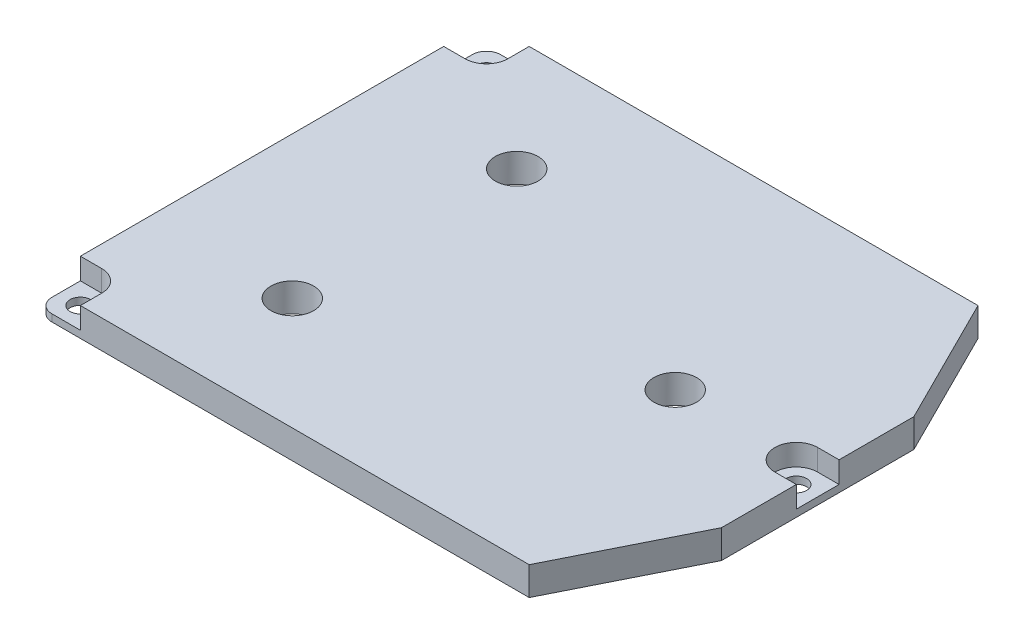
ISO-10303-21;
HEADER;
FILE_DESCRIPTION(('STEP AP214'),'2;1');
FILE_NAME('part.step','',(''),(''),'','','');
FILE_SCHEMA(('AUTOMOTIVE_DESIGN { 1 0 10303 214 1 1 1 1 }'));
ENDSEC;
DATA;
#1=APPLICATION_CONTEXT('core data for automotive mechanical design processes');
#2=APPLICATION_PROTOCOL_DEFINITION('international standard','automotive_design',2000,#1);
#3=PRODUCT_CONTEXT('',#1,'mechanical');
#4=PRODUCT('Part','Part','',(#3));
#5=PRODUCT_RELATED_PRODUCT_CATEGORY('part','',(#4));
#6=PRODUCT_DEFINITION_FORMATION('','',#4);
#7=PRODUCT_DEFINITION_CONTEXT('part definition',#1,'design');
#8=PRODUCT_DEFINITION('design','',#6,#7);
#9=PRODUCT_DEFINITION_SHAPE('','',#8);
#10=(LENGTH_UNIT() NAMED_UNIT(*) SI_UNIT(.MILLI.,.METRE.));
#11=(NAMED_UNIT(*) PLANE_ANGLE_UNIT() SI_UNIT($,.RADIAN.));
#12=(NAMED_UNIT(*) SI_UNIT($,.STERADIAN.) SOLID_ANGLE_UNIT());
#13=UNCERTAINTY_MEASURE_WITH_UNIT(LENGTH_MEASURE(1.E-05),#10,'distance_accuracy_value','');
#14=(GEOMETRIC_REPRESENTATION_CONTEXT(3) GLOBAL_UNCERTAINTY_ASSIGNED_CONTEXT((#13)) GLOBAL_UNIT_ASSIGNED_CONTEXT((#10,
#11,#12)) REPRESENTATION_CONTEXT('',''));
#15=CARTESIAN_POINT('',(0.,0.,0.));
#16=DIRECTION('',(0.,0.,1.));
#17=DIRECTION('',(1.,0.,0.));
#18=AXIS2_PLACEMENT_3D('',#15,#16,#17);
#19=CARTESIAN_POINT('',(75.,0.,-31.5));
#20=DIRECTION('',(0.,1.,0.));
#21=DIRECTION('',(0.,0.,1.));
#22=AXIS2_PLACEMENT_3D('',#19,#20,#21);
#23=CYLINDRICAL_SURFACE('',#22,1.45);
#24=CARTESIAN_POINT('',(75.,0.,-31.5));
#25=DIRECTION('',(0.,1.,0.));
#26=DIRECTION('',(0.,0.,1.));
#27=AXIS2_PLACEMENT_3D('',#24,#25,#26);
#28=CIRCLE('',#27,1.45);
#29=CARTESIAN_POINT('',(75.,0.,-30.05));
#30=VERTEX_POINT('',#29);
#31=EDGE_CURVE('E287',#30,#30,#28,.T.);
#32=ORIENTED_EDGE('',*,*,#31,.F.);
#33=EDGE_LOOP('',(#32));
#34=FACE_BOUND('',#33,.T.);
#35=CARTESIAN_POINT('',(75.,1.,-31.5));
#36=DIRECTION('',(0.,1.,0.));
#37=DIRECTION('',(0.,0.,1.));
#38=AXIS2_PLACEMENT_3D('',#35,#36,#37);
#39=CIRCLE('',#38,1.45);
#40=CARTESIAN_POINT('',(75.,1.,-30.05));
#41=VERTEX_POINT('',#40);
#42=EDGE_CURVE('E279',#41,#41,#39,.F.);
#43=ORIENTED_EDGE('',*,*,#42,.F.);
#44=EDGE_LOOP('',(#43));
#45=FACE_BOUND('',#44,.T.);
#46=ADVANCED_FACE('F36',(#34,#45),#23,.F.);
#47=CARTESIAN_POINT('',(3.,0.,-60.));
#48=DIRECTION('',(0.,1.,0.));
#49=DIRECTION('',(0.,0.,1.));
#50=AXIS2_PLACEMENT_3D('',#47,#48,#49);
#51=CYLINDRICAL_SURFACE('',#50,1.45);
#52=CARTESIAN_POINT('',(3.,0.,-60.));
#53=DIRECTION('',(0.,1.,0.));
#54=DIRECTION('',(0.,0.,1.));
#55=AXIS2_PLACEMENT_3D('',#52,#53,#54);
#56=CIRCLE('',#55,1.45);
#57=CARTESIAN_POINT('',(3.,0.,-58.55));
#58=VERTEX_POINT('',#57);
#59=EDGE_CURVE('E284',#58,#58,#56,.T.);
#60=ORIENTED_EDGE('',*,*,#59,.F.);
#61=EDGE_LOOP('',(#60));
#62=FACE_BOUND('',#61,.T.);
#63=CARTESIAN_POINT('',(3.,1.,-60.));
#64=DIRECTION('',(0.,1.,0.));
#65=DIRECTION('',(0.,0.,1.));
#66=AXIS2_PLACEMENT_3D('',#63,#64,#65);
#67=CIRCLE('',#66,1.45);
#68=CARTESIAN_POINT('',(3.,1.,-58.55));
#69=VERTEX_POINT('',#68);
#70=EDGE_CURVE('E276',#69,#69,#67,.F.);
#71=ORIENTED_EDGE('',*,*,#70,.F.);
#72=EDGE_LOOP('',(#71));
#73=FACE_BOUND('',#72,.T.);
#74=ADVANCED_FACE('F461',(#62,#73),#51,.F.);
#75=CARTESIAN_POINT('',(3.,0.,-3.));
#76=DIRECTION('',(0.,1.,0.));
#77=DIRECTION('',(0.,0.,1.));
#78=AXIS2_PLACEMENT_3D('',#75,#76,#77);
#79=CYLINDRICAL_SURFACE('',#78,1.45);
#80=CARTESIAN_POINT('',(3.,0.,-3.));
#81=DIRECTION('',(0.,1.,0.));
#82=DIRECTION('',(0.,0.,1.));
#83=AXIS2_PLACEMENT_3D('',#80,#81,#82);
#84=CIRCLE('',#83,1.45);
#85=CARTESIAN_POINT('',(3.,0.,-1.55));
#86=VERTEX_POINT('',#85);
#87=EDGE_CURVE('E280',#86,#86,#84,.T.);
#88=ORIENTED_EDGE('',*,*,#87,.F.);
#89=EDGE_LOOP('',(#88));
#90=FACE_BOUND('',#89,.T.);
#91=CARTESIAN_POINT('',(3.,1.,-3.));
#92=DIRECTION('',(0.,1.,0.));
#93=DIRECTION('',(0.,0.,1.));
#94=AXIS2_PLACEMENT_3D('',#91,#92,#93);
#95=CIRCLE('',#94,1.45);
#96=CARTESIAN_POINT('',(3.,1.,-1.55));
#97=VERTEX_POINT('',#96);
#98=EDGE_CURVE('E217',#97,#97,#95,.F.);
#99=ORIENTED_EDGE('',*,*,#98,.F.);
#100=EDGE_LOOP('',(#99));
#101=FACE_BOUND('',#100,.T.);
#102=ADVANCED_FACE('F467',(#90,#101),#79,.F.);
#103=CARTESIAN_POINT('',(2.,4.,-61.));
#104=DIRECTION('',(0.,-1.,0.));
#105=DIRECTION('',(0.,0.,-1.));
#106=AXIS2_PLACEMENT_3D('',#103,#104,#105);
#107=CYLINDRICAL_SURFACE('',#106,2.);
#108=DIRECTION('',(0.,-1.,0.));
#109=VECTOR('',#108,1.);
#110=CARTESIAN_POINT('',(0.,4.,-61.));
#111=LINE('',#110,#109);
#112=CARTESIAN_POINT('',(0.,1.,-61.));
#113=VERTEX_POINT('',#112);
#114=CARTESIAN_POINT('',(0.,0.,-61.));
#115=VERTEX_POINT('',#114);
#116=EDGE_CURVE('E335',#113,#115,#111,.T.);
#117=ORIENTED_EDGE('',*,*,#116,.F.);
#118=CARTESIAN_POINT('',(2.,1.,-61.));
#119=DIRECTION('',(0.,1.,0.));
#120=DIRECTION('',(0.,0.,1.));
#121=AXIS2_PLACEMENT_3D('',#118,#119,#120);
#122=CIRCLE('',#121,2.);
#123=CARTESIAN_POINT('',(2.,1.,-63.));
#124=VERTEX_POINT('',#123);
#125=EDGE_CURVE('E11',#113,#124,#122,.F.);
#126=ORIENTED_EDGE('',*,*,#125,.T.);
#127=DIRECTION('',(0.,-1.,0.));
#128=VECTOR('',#127,1.);
#129=CARTESIAN_POINT('',(2.,4.,-63.));
#130=LINE('',#129,#128);
#131=CARTESIAN_POINT('',(2.,0.,-63.));
#132=VERTEX_POINT('',#131);
#133=EDGE_CURVE('E341',#132,#124,#130,.F.);
#134=ORIENTED_EDGE('',*,*,#133,.F.);
#135=CARTESIAN_POINT('',(2.,0.,-61.));
#136=DIRECTION('',(0.,-1.,0.));
#137=DIRECTION('',(0.,0.,-1.));
#138=AXIS2_PLACEMENT_3D('',#135,#136,#137);
#139=CIRCLE('',#138,2.);
#140=EDGE_CURVE('E339',#115,#132,#139,.T.);
#141=ORIENTED_EDGE('',*,*,#140,.F.);
#142=EDGE_LOOP('',(#117,#126,#134,#141));
#143=FACE_BOUND('',#142,.T.);
#144=ADVANCED_FACE('F414',(#143),#107,.T.);
#145=CARTESIAN_POINT('',(2.,4.,-2.));
#146=DIRECTION('',(0.,-1.,0.));
#147=DIRECTION('',(0.,0.,-1.));
#148=AXIS2_PLACEMENT_3D('',#145,#146,#147);
#149=CYLINDRICAL_SURFACE('',#148,2.);
#150=DIRECTION('',(0.,-1.,0.));
#151=VECTOR('',#150,1.);
#152=CARTESIAN_POINT('',(2.,4.,0.));
#153=LINE('',#152,#151);
#154=CARTESIAN_POINT('',(2.,1.,0.));
#155=VERTEX_POINT('',#154);
#156=CARTESIAN_POINT('',(2.,0.,0.));
#157=VERTEX_POINT('',#156);
#158=EDGE_CURVE('E344',#155,#157,#153,.T.);
#159=ORIENTED_EDGE('',*,*,#158,.F.);
#160=CARTESIAN_POINT('',(2.,1.,-2.));
#161=DIRECTION('',(0.,1.,0.));
#162=DIRECTION('',(0.,0.,1.));
#163=AXIS2_PLACEMENT_3D('',#160,#161,#162);
#164=CIRCLE('',#163,2.);
#165=CARTESIAN_POINT('',(0.,1.,-2.));
#166=VERTEX_POINT('',#165);
#167=EDGE_CURVE('E45',#155,#166,#164,.F.);
#168=ORIENTED_EDGE('',*,*,#167,.T.);
#169=DIRECTION('',(0.,-1.,0.));
#170=VECTOR('',#169,1.);
#171=CARTESIAN_POINT('',(0.,4.,-2.));
#172=LINE('',#171,#170);
#173=CARTESIAN_POINT('',(0.,0.,-2.));
#174=VERTEX_POINT('',#173);
#175=EDGE_CURVE('E332',#174,#166,#172,.F.);
#176=ORIENTED_EDGE('',*,*,#175,.F.);
#177=CARTESIAN_POINT('',(2.,0.,-2.));
#178=DIRECTION('',(0.,-1.,0.));
#179=DIRECTION('',(0.,0.,-1.));
#180=AXIS2_PLACEMENT_3D('',#177,#178,#179);
#181=CIRCLE('',#180,2.);
#182=EDGE_CURVE('E337',#157,#174,#181,.T.);
#183=ORIENTED_EDGE('',*,*,#182,.F.);
#184=EDGE_LOOP('',(#159,#168,#176,#183));
#185=FACE_BOUND('',#184,.T.);
#186=ADVANCED_FACE('F38',(#185),#149,.T.);
#187=CARTESIAN_POINT('',(0.,4.,0.));
#188=DIRECTION('',(1.,0.,0.));
#189=DIRECTION('',(0.,0.,-1.));
#190=AXIS2_PLACEMENT_3D('',#187,#188,#189);
#191=PLANE('',#190);
#192=DIRECTION('',(0.,0.,1.));
#193=VECTOR('',#192,1.);
#194=CARTESIAN_POINT('',(0.,1.,-3.));
#195=LINE('',#194,#193);
#196=CARTESIAN_POINT('',(0.,1.,-6.));
#197=VERTEX_POINT('',#196);
#198=EDGE_CURVE('E194',#197,#166,#195,.T.);
#199=ORIENTED_EDGE('',*,*,#198,.F.);
#200=DIRECTION('',(0.,1.,0.));
#201=VECTOR('',#200,1.);
#202=CARTESIAN_POINT('',(0.,1.,-6.));
#203=LINE('',#202,#201);
#204=CARTESIAN_POINT('',(0.,4.,-6.));
#205=VERTEX_POINT('',#204);
#206=EDGE_CURVE('E185',#197,#205,#203,.T.);
#207=ORIENTED_EDGE('',*,*,#206,.T.);
#208=DIRECTION('',(0.,0.,1.));
#209=VECTOR('',#208,1.);
#210=CARTESIAN_POINT('',(0.,4.,0.));
#211=LINE('',#210,#209);
#212=CARTESIAN_POINT('',(0.,4.,-57.));
#213=VERTEX_POINT('',#212);
#214=EDGE_CURVE('E290',#213,#205,#211,.T.);
#215=ORIENTED_EDGE('',*,*,#214,.F.);
#216=DIRECTION('',(0.,1.,0.));
#217=VECTOR('',#216,1.);
#218=CARTESIAN_POINT('',(0.,1.,-57.));
#219=LINE('',#218,#217);
#220=CARTESIAN_POINT('',(0.,1.,-57.));
#221=VERTEX_POINT('',#220);
#222=EDGE_CURVE('E268',#221,#213,#219,.T.);
#223=ORIENTED_EDGE('',*,*,#222,.F.);
#224=DIRECTION('',(0.,0.,1.));
#225=VECTOR('',#224,1.);
#226=CARTESIAN_POINT('',(0.,1.,-57.));
#227=LINE('',#226,#225);
#228=EDGE_CURVE('E254',#113,#221,#227,.T.);
#229=ORIENTED_EDGE('',*,*,#228,.F.);
#230=ORIENTED_EDGE('',*,*,#116,.T.);
#231=DIRECTION('',(0.,0.,1.));
#232=VECTOR('',#231,1.);
#233=CARTESIAN_POINT('',(0.,0.,0.));
#234=LINE('',#233,#232);
#235=EDGE_CURVE('E283',#115,#174,#234,.T.);
#236=ORIENTED_EDGE('',*,*,#235,.T.);
#237=ORIENTED_EDGE('',*,*,#175,.T.);
#238=EDGE_LOOP('',(#199,#207,#215,#223,#229,#230,#236,#237));
#239=FACE_BOUND('',#238,.T.);
#240=ADVANCED_FACE('F383',(#239),#191,.F.);
#241=CARTESIAN_POINT('',(63.,4.,0.));
#242=DIRECTION('',(0.,0.,-1.));
#243=DIRECTION('',(-1.,0.,0.));
#244=AXIS2_PLACEMENT_3D('',#241,#242,#243);
#245=PLANE('',#244);
#246=DIRECTION('',(1.,0.,0.));
#247=VECTOR('',#246,1.);
#248=CARTESIAN_POINT('',(0.,4.,0.));
#249=LINE('',#248,#247);
#250=CARTESIAN_POINT('',(6.,4.,0.));
#251=VERTEX_POINT('',#250);
#252=CARTESIAN_POINT('',(69.,4.,0.));
#253=VERTEX_POINT('',#252);
#254=EDGE_CURVE('E293',#251,#253,#249,.T.);
#255=ORIENTED_EDGE('',*,*,#254,.F.);
#256=DIRECTION('',(0.,1.,0.));
#257=VECTOR('',#256,1.);
#258=CARTESIAN_POINT('',(6.,1.,0.));
#259=LINE('',#258,#257);
#260=CARTESIAN_POINT('',(6.,1.,0.));
#261=VERTEX_POINT('',#260);
#262=EDGE_CURVE('E218',#261,#251,#259,.T.);
#263=ORIENTED_EDGE('',*,*,#262,.F.);
#264=DIRECTION('',(1.,0.,0.));
#265=VECTOR('',#264,1.);
#266=CARTESIAN_POINT('',(6.,1.,0.));
#267=LINE('',#266,#265);
#268=EDGE_CURVE('E209',#155,#261,#267,.T.);
#269=ORIENTED_EDGE('',*,*,#268,.F.);
#270=ORIENTED_EDGE('',*,*,#158,.T.);
#271=DIRECTION('',(1.,0.,0.));
#272=VECTOR('',#271,1.);
#273=CARTESIAN_POINT('',(63.,0.,0.));
#274=LINE('',#273,#272);
#275=CARTESIAN_POINT('',(69.,0.,0.));
#276=VERTEX_POINT('',#275);
#277=EDGE_CURVE('E310',#157,#276,#274,.T.);
#278=ORIENTED_EDGE('',*,*,#277,.T.);
#279=DIRECTION('',(0.,-1.,0.));
#280=VECTOR('',#279,1.);
#281=CARTESIAN_POINT('',(69.,4.,0.));
#282=LINE('',#281,#280);
#283=EDGE_CURVE('E329',#253,#276,#282,.T.);
#284=ORIENTED_EDGE('',*,*,#283,.F.);
#285=EDGE_LOOP('',(#255,#263,#269,#270,#278,#284));
#286=FACE_BOUND('',#285,.T.);
#287=ADVANCED_FACE('F392',(#286),#245,.F.);
#288=CARTESIAN_POINT('',(69.,4.,0.));
#289=DIRECTION('',(-0.894427190999916,0.,-0.447213595499957));
#290=DIRECTION('',(-0.447213595499957,0.,0.894427190999916));
#291=AXIS2_PLACEMENT_3D('',#288,#289,#290);
#292=PLANE('',#291);
#293=DIRECTION('',(0.447213595499957,0.,-0.894427190999916));
#294=VECTOR('',#293,1.);
#295=CARTESIAN_POINT('',(69.,0.,0.));
#296=LINE('',#295,#294);
#297=CARTESIAN_POINT('',(78.,0.,-18.));
#298=VERTEX_POINT('',#297);
#299=EDGE_CURVE('E312',#276,#298,#296,.T.);
#300=ORIENTED_EDGE('',*,*,#299,.T.);
#301=DIRECTION('',(0.,-1.,0.));
#302=VECTOR('',#301,1.);
#303=CARTESIAN_POINT('',(78.,4.,-18.));
#304=LINE('',#303,#302);
#305=CARTESIAN_POINT('',(78.,4.,-18.));
#306=VERTEX_POINT('',#305);
#307=EDGE_CURVE('E326',#306,#298,#304,.T.);
#308=ORIENTED_EDGE('',*,*,#307,.F.);
#309=DIRECTION('',(0.447213595499957,0.,-0.894427190999916));
#310=VECTOR('',#309,1.);
#311=CARTESIAN_POINT('',(69.,4.,0.));
#312=LINE('',#311,#310);
#313=EDGE_CURVE('E296',#253,#306,#312,.T.);
#314=ORIENTED_EDGE('',*,*,#313,.F.);
#315=ORIENTED_EDGE('',*,*,#283,.T.);
#316=EDGE_LOOP('',(#300,#308,#314,#315));
#317=FACE_BOUND('',#316,.T.);
#318=ADVANCED_FACE('F433',(#317),#292,.F.);
#319=CARTESIAN_POINT('',(78.,4.,-18.));
#320=DIRECTION('',(-1.,0.,0.));
#321=DIRECTION('',(0.,0.,1.));
#322=AXIS2_PLACEMENT_3D('',#319,#320,#321);
#323=PLANE('',#322);
#324=DIRECTION('',(0.,0.,-1.));
#325=VECTOR('',#324,1.);
#326=CARTESIAN_POINT('',(78.,4.,-18.));
#327=LINE('',#326,#325);
#328=CARTESIAN_POINT('',(78.,4.,-34.5));
#329=VERTEX_POINT('',#328);
#330=CARTESIAN_POINT('',(78.,4.,-45.));
#331=VERTEX_POINT('',#330);
#332=EDGE_CURVE('E298',#329,#331,#327,.T.);
#333=ORIENTED_EDGE('',*,*,#332,.F.);
#334=DIRECTION('',(0.,1.,0.));
#335=VECTOR('',#334,1.);
#336=CARTESIAN_POINT('',(78.,1.,-34.5));
#337=LINE('',#336,#335);
#338=CARTESIAN_POINT('',(78.,1.,-34.5));
#339=VERTEX_POINT('',#338);
#340=EDGE_CURVE('E241',#339,#329,#337,.T.);
#341=ORIENTED_EDGE('',*,*,#340,.F.);
#342=DIRECTION('',(0.,0.,-1.));
#343=VECTOR('',#342,1.);
#344=CARTESIAN_POINT('',(78.,1.,-28.5));
#345=LINE('',#344,#343);
#346=CARTESIAN_POINT('',(78.,1.,-28.5));
#347=VERTEX_POINT('',#346);
#348=EDGE_CURVE('E228',#347,#339,#345,.T.);
#349=ORIENTED_EDGE('',*,*,#348,.F.);
#350=DIRECTION('',(0.,1.,0.));
#351=VECTOR('',#350,1.);
#352=CARTESIAN_POINT('',(78.,1.,-28.5));
#353=LINE('',#352,#351);
#354=CARTESIAN_POINT('',(78.,4.,-28.5));
#355=VERTEX_POINT('',#354);
#356=EDGE_CURVE('E243',#347,#355,#353,.T.);
#357=ORIENTED_EDGE('',*,*,#356,.T.);
#358=EDGE_CURVE('E299',#306,#355,#327,.T.);
#359=ORIENTED_EDGE('',*,*,#358,.F.);
#360=ORIENTED_EDGE('',*,*,#307,.T.);
#361=DIRECTION('',(0.,0.,-1.));
#362=VECTOR('',#361,1.);
#363=CARTESIAN_POINT('',(78.,0.,-18.));
#364=LINE('',#363,#362);
#365=CARTESIAN_POINT('',(78.,0.,-45.));
#366=VERTEX_POINT('',#365);
#367=EDGE_CURVE('E314',#298,#366,#364,.T.);
#368=ORIENTED_EDGE('',*,*,#367,.T.);
#369=DIRECTION('',(0.,-1.,0.));
#370=VECTOR('',#369,1.);
#371=CARTESIAN_POINT('',(78.,4.,-45.));
#372=LINE('',#371,#370);
#373=EDGE_CURVE('E323',#331,#366,#372,.T.);
#374=ORIENTED_EDGE('',*,*,#373,.F.);
#375=EDGE_LOOP('',(#333,#341,#349,#357,#359,#360,#368,#374));
#376=FACE_BOUND('',#375,.T.);
#377=ADVANCED_FACE('F427',(#376),#323,.F.);
#378=CARTESIAN_POINT('',(78.,4.,-45.));
#379=DIRECTION('',(-0.894427190999916,0.,0.447213595499958));
#380=DIRECTION('',(0.447213595499958,0.,0.894427190999916));
#381=AXIS2_PLACEMENT_3D('',#378,#379,#380);
#382=PLANE('',#381);
#383=DIRECTION('',(-0.447213595499958,0.,-0.894427190999916));
#384=VECTOR('',#383,1.);
#385=CARTESIAN_POINT('',(78.,0.,-45.));
#386=LINE('',#385,#384);
#387=CARTESIAN_POINT('',(69.,0.,-63.));
#388=VERTEX_POINT('',#387);
#389=EDGE_CURVE('E316',#366,#388,#386,.T.);
#390=ORIENTED_EDGE('',*,*,#389,.T.);
#391=DIRECTION('',(0.,-1.,0.));
#392=VECTOR('',#391,1.);
#393=CARTESIAN_POINT('',(69.,4.,-63.));
#394=LINE('',#393,#392);
#395=CARTESIAN_POINT('',(69.,4.,-63.));
#396=VERTEX_POINT('',#395);
#397=EDGE_CURVE('E307',#396,#388,#394,.T.);
#398=ORIENTED_EDGE('',*,*,#397,.F.);
#399=DIRECTION('',(-0.447213595499958,0.,-0.894427190999916));
#400=VECTOR('',#399,1.);
#401=CARTESIAN_POINT('',(78.,4.,-45.));
#402=LINE('',#401,#400);
#403=EDGE_CURVE('E302',#331,#396,#402,.T.);
#404=ORIENTED_EDGE('',*,*,#403,.F.);
#405=ORIENTED_EDGE('',*,*,#373,.T.);
#406=EDGE_LOOP('',(#390,#398,#404,#405));
#407=FACE_BOUND('',#406,.T.);
#408=ADVANCED_FACE('F422',(#407),#382,.F.);
#409=CARTESIAN_POINT('',(0.,4.,-63.));
#410=DIRECTION('',(0.,0.,1.));
#411=DIRECTION('',(1.,0.,0.));
#412=AXIS2_PLACEMENT_3D('',#409,#410,#411);
#413=PLANE('',#412);
#414=DIRECTION('',(-1.,0.,0.));
#415=VECTOR('',#414,1.);
#416=CARTESIAN_POINT('',(0.,1.,-63.));
#417=LINE('',#416,#415);
#418=CARTESIAN_POINT('',(6.,1.,-63.));
#419=VERTEX_POINT('',#418);
#420=EDGE_CURVE('E61',#419,#124,#417,.T.);
#421=ORIENTED_EDGE('',*,*,#420,.F.);
#422=DIRECTION('',(0.,1.,0.));
#423=VECTOR('',#422,1.);
#424=CARTESIAN_POINT('',(6.,1.,-63.));
#425=LINE('',#424,#423);
#426=CARTESIAN_POINT('',(6.,4.,-63.));
#427=VERTEX_POINT('',#426);
#428=EDGE_CURVE('E270',#419,#427,#425,.T.);
#429=ORIENTED_EDGE('',*,*,#428,.T.);
#430=DIRECTION('',(-1.,0.,0.));
#431=VECTOR('',#430,1.);
#432=CARTESIAN_POINT('',(69.,4.,-63.));
#433=LINE('',#432,#431);
#434=EDGE_CURVE('E304',#396,#427,#433,.T.);
#435=ORIENTED_EDGE('',*,*,#434,.F.);
#436=ORIENTED_EDGE('',*,*,#397,.T.);
#437=DIRECTION('',(-1.,0.,0.));
#438=VECTOR('',#437,1.);
#439=CARTESIAN_POINT('',(0.,0.,-63.));
#440=LINE('',#439,#438);
#441=EDGE_CURVE('E294',#388,#132,#440,.T.);
#442=ORIENTED_EDGE('',*,*,#441,.T.);
#443=ORIENTED_EDGE('',*,*,#133,.T.);
#444=EDGE_LOOP('',(#421,#429,#435,#436,#442,#443));
#445=FACE_BOUND('',#444,.T.);
#446=ADVANCED_FACE('F416',(#445),#413,.F.);
#447=CARTESIAN_POINT('',(0.,4.,0.));
#448=DIRECTION('',(0.,-1.,0.));
#449=DIRECTION('',(0.,0.,-1.));
#450=AXIS2_PLACEMENT_3D('',#447,#448,#449);
#451=PLANE('',#450);
#452=CARTESIAN_POINT('',(20.,4.,-47.25));
#453=DIRECTION('',(0.,1.,0.));
#454=DIRECTION('',(0.,0.,1.));
#455=AXIS2_PLACEMENT_3D('',#452,#453,#454);
#456=CIRCLE('',#455,3.);
#457=CARTESIAN_POINT('',(20.,4.,-44.25));
#458=VERTEX_POINT('',#457);
#459=EDGE_CURVE('E353',#458,#458,#456,.T.);
#460=ORIENTED_EDGE('',*,*,#459,.F.);
#461=EDGE_LOOP('',(#460));
#462=FACE_BOUND('',#461,.T.);
#463=CARTESIAN_POINT('',(20.,4.,-15.75));
#464=DIRECTION('',(0.,1.,0.));
#465=DIRECTION('',(0.,0.,1.));
#466=AXIS2_PLACEMENT_3D('',#463,#464,#465);
#467=CIRCLE('',#466,3.);
#468=CARTESIAN_POINT('',(20.,4.,-12.75));
#469=VERTEX_POINT('',#468);
#470=EDGE_CURVE('E691',#469,#469,#467,.T.);
#471=ORIENTED_EDGE('',*,*,#470,.F.);
#472=EDGE_LOOP('',(#471));
#473=FACE_BOUND('',#472,.T.);
#474=CARTESIAN_POINT('',(58.,4.,-31.5));
#475=DIRECTION('',(0.,1.,0.));
#476=DIRECTION('',(0.,0.,1.));
#477=AXIS2_PLACEMENT_3D('',#474,#475,#476);
#478=CIRCLE('',#477,3.);
#479=CARTESIAN_POINT('',(58.,4.,-28.5));
#480=VERTEX_POINT('',#479);
#481=EDGE_CURVE('E205',#480,#480,#478,.T.);
#482=ORIENTED_EDGE('',*,*,#481,.F.);
#483=EDGE_LOOP('',(#482));
#484=FACE_BOUND('',#483,.T.);
#485=CARTESIAN_POINT('',(3.,4.,-3.));
#486=DIRECTION('',(0.,1.,0.));
#487=DIRECTION('',(0.,0.,1.));
#488=AXIS2_PLACEMENT_3D('',#485,#486,#487);
#489=CIRCLE('',#488,3.);
#490=CARTESIAN_POINT('',(6.,4.,-3.));
#491=VERTEX_POINT('',#490);
#492=CARTESIAN_POINT('',(3.,4.,-6.));
#493=VERTEX_POINT('',#492);
#494=EDGE_CURVE('E182',#491,#493,#489,.T.);
#495=ORIENTED_EDGE('',*,*,#494,.F.);
#496=DIRECTION('',(0.,0.,-1.));
#497=VECTOR('',#496,1.);
#498=CARTESIAN_POINT('',(6.,4.,-3.));
#499=LINE('',#498,#497);
#500=EDGE_CURVE('E199',#251,#491,#499,.T.);
#501=ORIENTED_EDGE('',*,*,#500,.F.);
#502=ORIENTED_EDGE('',*,*,#254,.T.);
#503=ORIENTED_EDGE('',*,*,#313,.T.);
#504=ORIENTED_EDGE('',*,*,#358,.T.);
#505=DIRECTION('',(1.,0.,0.));
#506=VECTOR('',#505,1.);
#507=CARTESIAN_POINT('',(75.,4.,-28.5));
#508=LINE('',#507,#506);
#509=CARTESIAN_POINT('',(75.,4.,-28.5));
#510=VERTEX_POINT('',#509);
#511=EDGE_CURVE('E235',#510,#355,#508,.T.);
#512=ORIENTED_EDGE('',*,*,#511,.F.);
#513=CARTESIAN_POINT('',(75.,4.,-31.5));
#514=DIRECTION('',(0.,1.,0.));
#515=DIRECTION('',(0.,0.,1.));
#516=AXIS2_PLACEMENT_3D('',#513,#514,#515);
#517=CIRCLE('',#516,3.00000000000002);
#518=CARTESIAN_POINT('',(75.,4.,-34.5));
#519=VERTEX_POINT('',#518);
#520=EDGE_CURVE('E53',#519,#510,#517,.T.);
#521=ORIENTED_EDGE('',*,*,#520,.F.);
#522=DIRECTION('',(-1.,0.,0.));
#523=VECTOR('',#522,1.);
#524=CARTESIAN_POINT('',(78.,4.,-34.5));
#525=LINE('',#524,#523);
#526=EDGE_CURVE('E225',#329,#519,#525,.T.);
#527=ORIENTED_EDGE('',*,*,#526,.F.);
#528=ORIENTED_EDGE('',*,*,#332,.T.);
#529=ORIENTED_EDGE('',*,*,#403,.T.);
#530=ORIENTED_EDGE('',*,*,#434,.T.);
#531=DIRECTION('',(0.,0.,-1.));
#532=VECTOR('',#531,1.);
#533=CARTESIAN_POINT('',(6.,4.,-63.));
#534=LINE('',#533,#532);
#535=CARTESIAN_POINT('',(6.,4.,-60.));
#536=VERTEX_POINT('',#535);
#537=EDGE_CURVE('E263',#536,#427,#534,.T.);
#538=ORIENTED_EDGE('',*,*,#537,.F.);
#539=CARTESIAN_POINT('',(3.,4.,-60.));
#540=DIRECTION('',(0.,1.,0.));
#541=DIRECTION('',(0.,0.,1.));
#542=AXIS2_PLACEMENT_3D('',#539,#540,#541);
#543=CIRCLE('',#542,3.);
#544=CARTESIAN_POINT('',(3.,4.,-57.));
#545=VERTEX_POINT('',#544);
#546=EDGE_CURVE('E260',#545,#536,#543,.T.);
#547=ORIENTED_EDGE('',*,*,#546,.F.);
#548=DIRECTION('',(1.,0.,0.));
#549=VECTOR('',#548,1.);
#550=CARTESIAN_POINT('',(3.,4.,-57.));
#551=LINE('',#550,#549);
#552=EDGE_CURVE('E251',#213,#545,#551,.T.);
#553=ORIENTED_EDGE('',*,*,#552,.F.);
#554=ORIENTED_EDGE('',*,*,#214,.T.);
#555=DIRECTION('',(-1.,0.,0.));
#556=VECTOR('',#555,1.);
#557=CARTESIAN_POINT('',(0.,4.,-6.));
#558=LINE('',#557,#556);
#559=EDGE_CURVE('E202',#493,#205,#558,.T.);
#560=ORIENTED_EDGE('',*,*,#559,.F.);
#561=EDGE_LOOP('',(#495,#501,#502,#503,#504,#512,#521,#527,#528,#529,#530,#538,#547,#553,#554,#560));
#562=FACE_BOUND('',#561,.T.);
#563=ADVANCED_FACE('F366',(#462,#473,#484,#562),#451,.F.);
#564=CARTESIAN_POINT('',(0.,0.,0.));
#565=DIRECTION('',(0.,-1.,0.));
#566=DIRECTION('',(0.,0.,-1.));
#567=AXIS2_PLACEMENT_3D('',#564,#565,#566);
#568=PLANE('',#567);
#569=CARTESIAN_POINT('',(20.,0.,-47.25));
#570=DIRECTION('',(0.,-1.,0.));
#571=DIRECTION('',(0.,0.,-1.));
#572=AXIS2_PLACEMENT_3D('',#569,#570,#571);
#573=CIRCLE('',#572,3.);
#574=CARTESIAN_POINT('',(20.,0.,-50.25));
#575=VERTEX_POINT('',#574);
#576=EDGE_CURVE('E40',#575,#575,#573,.T.);
#577=ORIENTED_EDGE('',*,*,#576,.F.);
#578=EDGE_LOOP('',(#577));
#579=FACE_BOUND('',#578,.T.);
#580=CARTESIAN_POINT('',(20.,0.,-15.75));
#581=DIRECTION('',(0.,-1.,0.));
#582=DIRECTION('',(0.,0.,-1.));
#583=AXIS2_PLACEMENT_3D('',#580,#581,#582);
#584=CIRCLE('',#583,3.);
#585=CARTESIAN_POINT('',(20.,0.,-18.75));
#586=VERTEX_POINT('',#585);
#587=EDGE_CURVE('E352',#586,#586,#584,.T.);
#588=ORIENTED_EDGE('',*,*,#587,.F.);
#589=EDGE_LOOP('',(#588));
#590=FACE_BOUND('',#589,.T.);
#591=CARTESIAN_POINT('',(58.,0.,-31.5));
#592=DIRECTION('',(0.,-1.,0.));
#593=DIRECTION('',(0.,0.,-1.));
#594=AXIS2_PLACEMENT_3D('',#591,#592,#593);
#595=CIRCLE('',#594,3.);
#596=CARTESIAN_POINT('',(58.,0.,-34.5));
#597=VERTEX_POINT('',#596);
#598=EDGE_CURVE('E350',#597,#597,#595,.T.);
#599=ORIENTED_EDGE('',*,*,#598,.F.);
#600=EDGE_LOOP('',(#599));
#601=FACE_BOUND('',#600,.T.);
#602=ORIENTED_EDGE('',*,*,#87,.T.);
#603=EDGE_LOOP('',(#602));
#604=FACE_BOUND('',#603,.T.);
#605=ORIENTED_EDGE('',*,*,#59,.T.);
#606=EDGE_LOOP('',(#605));
#607=FACE_BOUND('',#606,.T.);
#608=ORIENTED_EDGE('',*,*,#31,.T.);
#609=EDGE_LOOP('',(#608));
#610=FACE_BOUND('',#609,.T.);
#611=ORIENTED_EDGE('',*,*,#235,.F.);
#612=ORIENTED_EDGE('',*,*,#140,.T.);
#613=ORIENTED_EDGE('',*,*,#441,.F.);
#614=ORIENTED_EDGE('',*,*,#389,.F.);
#615=ORIENTED_EDGE('',*,*,#367,.F.);
#616=ORIENTED_EDGE('',*,*,#299,.F.);
#617=ORIENTED_EDGE('',*,*,#277,.F.);
#618=ORIENTED_EDGE('',*,*,#182,.T.);
#619=EDGE_LOOP('',(#611,#612,#613,#614,#615,#616,#617,#618));
#620=FACE_BOUND('',#619,.T.);
#621=ADVANCED_FACE('F363',(#579,#590,#601,#604,#607,#610,#620),#568,.T.);
#622=CARTESIAN_POINT('',(3.,1.,-3.));
#623=DIRECTION('',(0.,1.,0.));
#624=DIRECTION('',(0.,0.,1.));
#625=AXIS2_PLACEMENT_3D('',#622,#623,#624);
#626=PLANE('',#625);
#627=ORIENTED_EDGE('',*,*,#268,.T.);
#628=DIRECTION('',(0.,0.,-1.));
#629=VECTOR('',#628,1.);
#630=CARTESIAN_POINT('',(6.,1.,-3.));
#631=LINE('',#630,#629);
#632=CARTESIAN_POINT('',(6.,1.,-3.));
#633=VERTEX_POINT('',#632);
#634=EDGE_CURVE('E186',#261,#633,#631,.T.);
#635=ORIENTED_EDGE('',*,*,#634,.T.);
#636=CARTESIAN_POINT('',(3.,1.,-3.));
#637=DIRECTION('',(0.,1.,0.));
#638=DIRECTION('',(0.,0.,1.));
#639=AXIS2_PLACEMENT_3D('',#636,#637,#638);
#640=CIRCLE('',#639,3.);
#641=CARTESIAN_POINT('',(3.,1.,-6.));
#642=VERTEX_POINT('',#641);
#643=EDGE_CURVE('E179',#633,#642,#640,.T.);
#644=ORIENTED_EDGE('',*,*,#643,.T.);
#645=DIRECTION('',(-1.,0.,0.));
#646=VECTOR('',#645,1.);
#647=CARTESIAN_POINT('',(0.,1.,-6.));
#648=LINE('',#647,#646);
#649=EDGE_CURVE('E189',#642,#197,#648,.T.);
#650=ORIENTED_EDGE('',*,*,#649,.T.);
#651=ORIENTED_EDGE('',*,*,#198,.T.);
#652=ORIENTED_EDGE('',*,*,#167,.F.);
#653=EDGE_LOOP('',(#627,#635,#644,#650,#651,#652));
#654=FACE_BOUND('',#653,.T.);
#655=ORIENTED_EDGE('',*,*,#98,.T.);
#656=EDGE_LOOP('',(#655));
#657=FACE_BOUND('',#656,.T.);
#658=ADVANCED_FACE('F196',(#654,#657),#626,.T.);
#659=CARTESIAN_POINT('',(3.,1.,-3.));
#660=DIRECTION('',(0.,1.,0.));
#661=DIRECTION('',(0.,0.,1.));
#662=AXIS2_PLACEMENT_3D('',#659,#660,#661);
#663=CYLINDRICAL_SURFACE('',#662,3.);
#664=ORIENTED_EDGE('',*,*,#494,.T.);
#665=DIRECTION('',(0.,1.,0.));
#666=VECTOR('',#665,1.);
#667=CARTESIAN_POINT('',(3.,1.,-6.));
#668=LINE('',#667,#666);
#669=EDGE_CURVE('E175',#642,#493,#668,.T.);
#670=ORIENTED_EDGE('',*,*,#669,.F.);
#671=ORIENTED_EDGE('',*,*,#643,.F.);
#672=DIRECTION('',(0.,1.,0.));
#673=VECTOR('',#672,1.);
#674=CARTESIAN_POINT('',(6.,1.,-3.));
#675=LINE('',#674,#673);
#676=EDGE_CURVE('E215',#633,#491,#675,.T.);
#677=ORIENTED_EDGE('',*,*,#676,.T.);
#678=EDGE_LOOP('',(#664,#670,#671,#677));
#679=FACE_BOUND('',#678,.T.);
#680=ADVANCED_FACE('F177',(#679),#663,.F.);
#681=CARTESIAN_POINT('',(6.,1.,-3.));
#682=DIRECTION('',(1.,0.,0.));
#683=DIRECTION('',(0.,0.,-1.));
#684=AXIS2_PLACEMENT_3D('',#681,#682,#683);
#685=PLANE('',#684);
#686=ORIENTED_EDGE('',*,*,#500,.T.);
#687=ORIENTED_EDGE('',*,*,#676,.F.);
#688=ORIENTED_EDGE('',*,*,#634,.F.);
#689=ORIENTED_EDGE('',*,*,#262,.T.);
#690=EDGE_LOOP('',(#686,#687,#688,#689));
#691=FACE_BOUND('',#690,.T.);
#692=ADVANCED_FACE('F396',(#691),#685,.F.);
#693=CARTESIAN_POINT('',(0.,1.,-6.));
#694=DIRECTION('',(0.,0.,-1.));
#695=DIRECTION('',(-1.,0.,0.));
#696=AXIS2_PLACEMENT_3D('',#693,#694,#695);
#697=PLANE('',#696);
#698=ORIENTED_EDGE('',*,*,#559,.T.);
#699=ORIENTED_EDGE('',*,*,#206,.F.);
#700=ORIENTED_EDGE('',*,*,#649,.F.);
#701=ORIENTED_EDGE('',*,*,#669,.T.);
#702=EDGE_LOOP('',(#698,#699,#700,#701));
#703=FACE_BOUND('',#702,.T.);
#704=ADVANCED_FACE('F190',(#703),#697,.F.);
#705=CARTESIAN_POINT('',(3.,1.,-60.));
#706=DIRECTION('',(0.,1.,0.));
#707=DIRECTION('',(0.,0.,1.));
#708=AXIS2_PLACEMENT_3D('',#705,#706,#707);
#709=PLANE('',#708);
#710=ORIENTED_EDGE('',*,*,#228,.T.);
#711=DIRECTION('',(1.,0.,0.));
#712=VECTOR('',#711,1.);
#713=CARTESIAN_POINT('',(3.,1.,-57.));
#714=LINE('',#713,#712);
#715=CARTESIAN_POINT('',(3.,1.,-57.));
#716=VERTEX_POINT('',#715);
#717=EDGE_CURVE('E256',#221,#716,#714,.T.);
#718=ORIENTED_EDGE('',*,*,#717,.T.);
#719=CARTESIAN_POINT('',(3.,1.,-60.));
#720=DIRECTION('',(0.,1.,0.));
#721=DIRECTION('',(0.,0.,1.));
#722=AXIS2_PLACEMENT_3D('',#719,#720,#721);
#723=CIRCLE('',#722,3.);
#724=CARTESIAN_POINT('',(6.,1.,-60.));
#725=VERTEX_POINT('',#724);
#726=EDGE_CURVE('E247',#716,#725,#723,.T.);
#727=ORIENTED_EDGE('',*,*,#726,.T.);
#728=DIRECTION('',(0.,0.,-1.));
#729=VECTOR('',#728,1.);
#730=CARTESIAN_POINT('',(6.,1.,-63.));
#731=LINE('',#730,#729);
#732=EDGE_CURVE('E250',#725,#419,#731,.T.);
#733=ORIENTED_EDGE('',*,*,#732,.T.);
#734=ORIENTED_EDGE('',*,*,#420,.T.);
#735=ORIENTED_EDGE('',*,*,#125,.F.);
#736=EDGE_LOOP('',(#710,#718,#727,#733,#734,#735));
#737=FACE_BOUND('',#736,.T.);
#738=ORIENTED_EDGE('',*,*,#70,.T.);
#739=EDGE_LOOP('',(#738));
#740=FACE_BOUND('',#739,.T.);
#741=ADVANCED_FACE('F410',(#737,#740),#709,.T.);
#742=CARTESIAN_POINT('',(3.,1.,-60.));
#743=DIRECTION('',(0.,1.,0.));
#744=DIRECTION('',(0.,0.,1.));
#745=AXIS2_PLACEMENT_3D('',#742,#743,#744);
#746=CYLINDRICAL_SURFACE('',#745,3.);
#747=ORIENTED_EDGE('',*,*,#546,.T.);
#748=DIRECTION('',(0.,1.,0.));
#749=VECTOR('',#748,1.);
#750=CARTESIAN_POINT('',(6.,1.,-60.));
#751=LINE('',#750,#749);
#752=EDGE_CURVE('E259',#725,#536,#751,.T.);
#753=ORIENTED_EDGE('',*,*,#752,.F.);
#754=ORIENTED_EDGE('',*,*,#726,.F.);
#755=DIRECTION('',(0.,1.,0.));
#756=VECTOR('',#755,1.);
#757=CARTESIAN_POINT('',(3.,1.,-57.));
#758=LINE('',#757,#756);
#759=EDGE_CURVE('E236',#716,#545,#758,.T.);
#760=ORIENTED_EDGE('',*,*,#759,.T.);
#761=EDGE_LOOP('',(#747,#753,#754,#760));
#762=FACE_BOUND('',#761,.T.);
#763=ADVANCED_FACE('F407',(#762),#746,.F.);
#764=CARTESIAN_POINT('',(3.,1.,-57.));
#765=DIRECTION('',(0.,0.,1.));
#766=DIRECTION('',(1.,0.,0.));
#767=AXIS2_PLACEMENT_3D('',#764,#765,#766);
#768=PLANE('',#767);
#769=ORIENTED_EDGE('',*,*,#552,.T.);
#770=ORIENTED_EDGE('',*,*,#759,.F.);
#771=ORIENTED_EDGE('',*,*,#717,.F.);
#772=ORIENTED_EDGE('',*,*,#222,.T.);
#773=EDGE_LOOP('',(#769,#770,#771,#772));
#774=FACE_BOUND('',#773,.T.);
#775=ADVANCED_FACE('F403',(#774),#768,.F.);
#776=CARTESIAN_POINT('',(6.,1.,-63.));
#777=DIRECTION('',(1.,0.,0.));
#778=DIRECTION('',(0.,0.,-1.));
#779=AXIS2_PLACEMENT_3D('',#776,#777,#778);
#780=PLANE('',#779);
#781=ORIENTED_EDGE('',*,*,#537,.T.);
#782=ORIENTED_EDGE('',*,*,#428,.F.);
#783=ORIENTED_EDGE('',*,*,#732,.F.);
#784=ORIENTED_EDGE('',*,*,#752,.T.);
#785=EDGE_LOOP('',(#781,#782,#783,#784));
#786=FACE_BOUND('',#785,.T.);
#787=ADVANCED_FACE('F450',(#786),#780,.F.);
#788=CARTESIAN_POINT('',(75.,1.,-31.5));
#789=DIRECTION('',(0.,1.,0.));
#790=DIRECTION('',(0.,0.,1.));
#791=AXIS2_PLACEMENT_3D('',#788,#789,#790);
#792=PLANE('',#791);
#793=CARTESIAN_POINT('',(75.,1.,-31.5));
#794=DIRECTION('',(0.,1.,0.));
#795=DIRECTION('',(0.,0.,1.));
#796=AXIS2_PLACEMENT_3D('',#793,#794,#795);
#797=CIRCLE('',#796,3.00000000000002);
#798=CARTESIAN_POINT('',(75.,1.,-34.5));
#799=VERTEX_POINT('',#798);
#800=CARTESIAN_POINT('',(75.,1.,-28.5));
#801=VERTEX_POINT('',#800);
#802=EDGE_CURVE('E221',#799,#801,#797,.T.);
#803=ORIENTED_EDGE('',*,*,#802,.T.);
#804=DIRECTION('',(1.,0.,0.));
#805=VECTOR('',#804,1.);
#806=CARTESIAN_POINT('',(75.,1.,-28.5));
#807=LINE('',#806,#805);
#808=EDGE_CURVE('E224',#801,#347,#807,.T.);
#809=ORIENTED_EDGE('',*,*,#808,.T.);
#810=ORIENTED_EDGE('',*,*,#348,.T.);
#811=DIRECTION('',(-1.,0.,0.));
#812=VECTOR('',#811,1.);
#813=CARTESIAN_POINT('',(78.,1.,-34.5));
#814=LINE('',#813,#812);
#815=EDGE_CURVE('E230',#339,#799,#814,.T.);
#816=ORIENTED_EDGE('',*,*,#815,.T.);
#817=EDGE_LOOP('',(#803,#809,#810,#816));
#818=FACE_BOUND('',#817,.T.);
#819=ORIENTED_EDGE('',*,*,#42,.T.);
#820=EDGE_LOOP('',(#819));
#821=FACE_BOUND('',#820,.T.);
#822=ADVANCED_FACE('F441',(#818,#821),#792,.T.);
#823=CARTESIAN_POINT('',(75.,1.,-31.5));
#824=DIRECTION('',(0.,1.,0.));
#825=DIRECTION('',(0.,0.,1.));
#826=AXIS2_PLACEMENT_3D('',#823,#824,#825);
#827=CYLINDRICAL_SURFACE('',#826,3.00000000000002);
#828=ORIENTED_EDGE('',*,*,#520,.T.);
#829=DIRECTION('',(0.,1.,0.));
#830=VECTOR('',#829,1.);
#831=CARTESIAN_POINT('',(75.,1.,-28.5));
#832=LINE('',#831,#830);
#833=EDGE_CURVE('E233',#801,#510,#832,.T.);
#834=ORIENTED_EDGE('',*,*,#833,.F.);
#835=ORIENTED_EDGE('',*,*,#802,.F.);
#836=DIRECTION('',(0.,1.,0.));
#837=VECTOR('',#836,1.);
#838=CARTESIAN_POINT('',(75.,1.,-34.5));
#839=LINE('',#838,#837);
#840=EDGE_CURVE('E213',#799,#519,#839,.T.);
#841=ORIENTED_EDGE('',*,*,#840,.T.);
#842=EDGE_LOOP('',(#828,#834,#835,#841));
#843=FACE_BOUND('',#842,.T.);
#844=ADVANCED_FACE('F445',(#843),#827,.F.);
#845=CARTESIAN_POINT('',(78.,1.,-34.5));
#846=DIRECTION('',(0.,0.,-1.));
#847=DIRECTION('',(-1.,0.,0.));
#848=AXIS2_PLACEMENT_3D('',#845,#846,#847);
#849=PLANE('',#848);
#850=ORIENTED_EDGE('',*,*,#526,.T.);
#851=ORIENTED_EDGE('',*,*,#840,.F.);
#852=ORIENTED_EDGE('',*,*,#815,.F.);
#853=ORIENTED_EDGE('',*,*,#340,.T.);
#854=EDGE_LOOP('',(#850,#851,#852,#853));
#855=FACE_BOUND('',#854,.T.);
#856=ADVANCED_FACE('F448',(#855),#849,.F.);
#857=CARTESIAN_POINT('',(75.,1.,-28.5));
#858=DIRECTION('',(0.,0.,1.));
#859=DIRECTION('',(1.,0.,0.));
#860=AXIS2_PLACEMENT_3D('',#857,#858,#859);
#861=PLANE('',#860);
#862=ORIENTED_EDGE('',*,*,#511,.T.);
#863=ORIENTED_EDGE('',*,*,#356,.F.);
#864=ORIENTED_EDGE('',*,*,#808,.F.);
#865=ORIENTED_EDGE('',*,*,#833,.T.);
#866=EDGE_LOOP('',(#862,#863,#864,#865));
#867=FACE_BOUND('',#866,.T.);
#868=ADVANCED_FACE('F439',(#867),#861,.F.);
#869=CARTESIAN_POINT('',(58.,-6.,-31.5));
#870=DIRECTION('',(0.,1.,0.));
#871=DIRECTION('',(0.,0.,1.));
#872=AXIS2_PLACEMENT_3D('',#869,#870,#871);
#873=CYLINDRICAL_SURFACE('',#872,3.);
#874=ORIENTED_EDGE('',*,*,#598,.T.);
#875=EDGE_LOOP('',(#874));
#876=FACE_BOUND('',#875,.T.);
#877=ORIENTED_EDGE('',*,*,#481,.T.);
#878=EDGE_LOOP('',(#877));
#879=FACE_BOUND('',#878,.T.);
#880=ADVANCED_FACE('F510',(#876,#879),#873,.F.);
#881=CARTESIAN_POINT('',(20.,-6.,-15.75));
#882=DIRECTION('',(0.,1.,0.));
#883=DIRECTION('',(0.,0.,1.));
#884=AXIS2_PLACEMENT_3D('',#881,#882,#883);
#885=CYLINDRICAL_SURFACE('',#884,3.);
#886=ORIENTED_EDGE('',*,*,#587,.T.);
#887=EDGE_LOOP('',(#886));
#888=FACE_BOUND('',#887,.T.);
#889=ORIENTED_EDGE('',*,*,#470,.T.);
#890=EDGE_LOOP('',(#889));
#891=FACE_BOUND('',#890,.T.);
#892=ADVANCED_FACE('F521',(#888,#891),#885,.F.);
#893=CARTESIAN_POINT('',(20.,-6.,-47.25));
#894=DIRECTION('',(0.,1.,0.));
#895=DIRECTION('',(0.,0.,1.));
#896=AXIS2_PLACEMENT_3D('',#893,#894,#895);
#897=CYLINDRICAL_SURFACE('',#896,3.);
#898=ORIENTED_EDGE('',*,*,#576,.T.);
#899=EDGE_LOOP('',(#898));
#900=FACE_BOUND('',#899,.T.);
#901=ORIENTED_EDGE('',*,*,#459,.T.);
#902=EDGE_LOOP('',(#901));
#903=FACE_BOUND('',#902,.T.);
#904=ADVANCED_FACE('F360',(#900,#903),#897,.F.);
#905=CLOSED_SHELL('',(#46,#74,#102,#144,#186,#240,#287,#318,#377,#408,#446,#563,#621,#658,#680,
#692,#704,#741,#763,#775,#787,#822,#844,#856,#868,#880,#892,#904));
#906=MANIFOLD_SOLID_BREP('B2',#905);
#907=ADVANCED_BREP_SHAPE_REPRESENTATION('',(#18,#906),#14);
#908=SHAPE_DEFINITION_REPRESENTATION(#9,#907);
ENDSEC;
END-ISO-10303-21;
